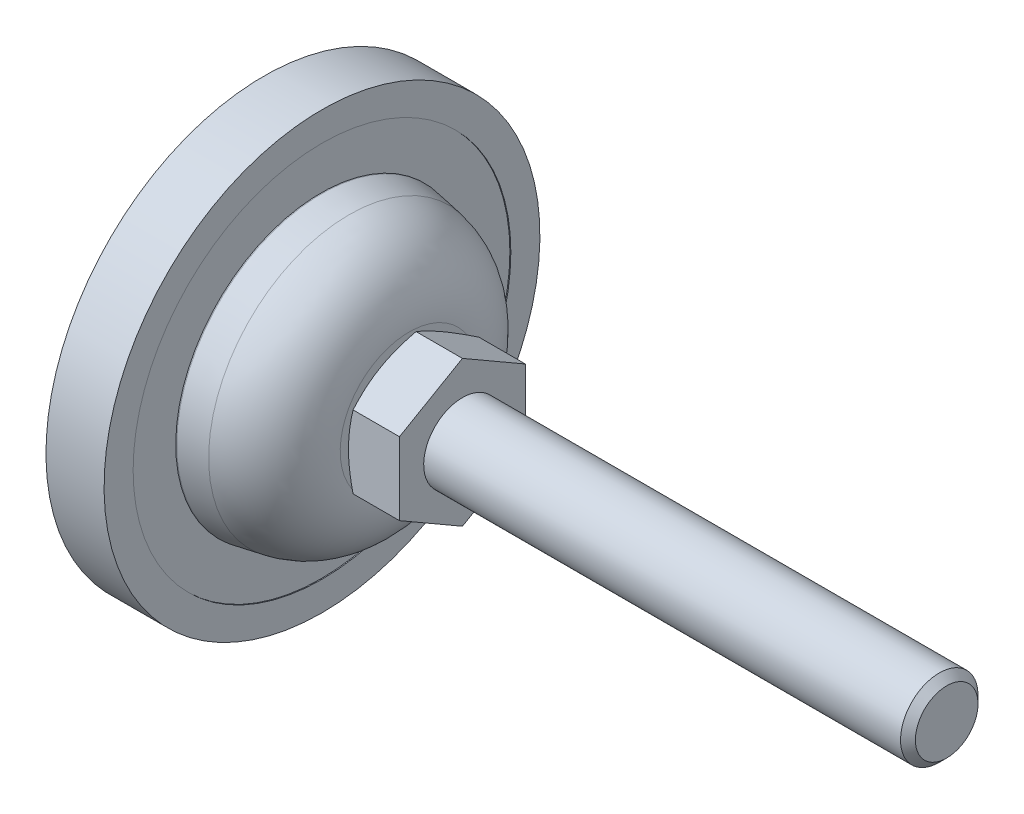
ISO-10303-21;
HEADER;
FILE_DESCRIPTION(('STEP AP214'),'2;1');
FILE_NAME('part.step','',(''),(''),'','','');
FILE_SCHEMA(('AUTOMOTIVE_DESIGN { 1 0 10303 214 1 1 1 1 }'));
ENDSEC;
DATA;
#1=APPLICATION_CONTEXT('core data for automotive mechanical design processes');
#2=APPLICATION_PROTOCOL_DEFINITION('international standard','automotive_design',2000,#1);
#3=PRODUCT_CONTEXT('',#1,'mechanical');
#4=PRODUCT('Part','Part','',(#3));
#5=PRODUCT_RELATED_PRODUCT_CATEGORY('part','',(#4));
#6=PRODUCT_DEFINITION_FORMATION('','',#4);
#7=PRODUCT_DEFINITION_CONTEXT('part definition',#1,'design');
#8=PRODUCT_DEFINITION('design','',#6,#7);
#9=PRODUCT_DEFINITION_SHAPE('','',#8);
#10=(LENGTH_UNIT() NAMED_UNIT(*) SI_UNIT(.MILLI.,.METRE.));
#11=(NAMED_UNIT(*) PLANE_ANGLE_UNIT() SI_UNIT($,.RADIAN.));
#12=(NAMED_UNIT(*) SI_UNIT($,.STERADIAN.) SOLID_ANGLE_UNIT());
#13=UNCERTAINTY_MEASURE_WITH_UNIT(LENGTH_MEASURE(1.E-05),#10,'distance_accuracy_value','');
#14=(GEOMETRIC_REPRESENTATION_CONTEXT(3) GLOBAL_UNCERTAINTY_ASSIGNED_CONTEXT((#13)) GLOBAL_UNIT_ASSIGNED_CONTEXT((#10,
#11,#12)) REPRESENTATION_CONTEXT('',''));
#15=CARTESIAN_POINT('',(0.,0.,0.));
#16=DIRECTION('',(0.,0.,1.));
#17=DIRECTION('',(1.,0.,0.));
#18=AXIS2_PLACEMENT_3D('',#15,#16,#17);
#19=CARTESIAN_POINT('',(0.,22.77,-22.77));
#20=DIRECTION('',(-1.,0.,0.));
#21=DIRECTION('',(0.,-1.,0.));
#22=AXIS2_PLACEMENT_3D('',#19,#20,#21);
#23=PLANE('',#22);
#24=CARTESIAN_POINT('',(0.,0.,0.));
#25=DIRECTION('',(-1.,0.,0.));
#26=DIRECTION('',(0.,-1.,0.));
#27=AXIS2_PLACEMENT_3D('',#24,#25,#26);
#28=CIRCLE('',#27,22.5);
#29=CARTESIAN_POINT('',(0.,-22.5,0.));
#30=VERTEX_POINT('',#29);
#31=EDGE_CURVE('E20',#30,#30,#28,.F.);
#32=ORIENTED_EDGE('',*,*,#31,.F.);
#33=EDGE_LOOP('',(#32));
#34=FACE_BOUND('',#33,.T.);
#35=ADVANCED_FACE('F17',(#34),#23,.T.);
#36=CARTESIAN_POINT('',(0.,0.,0.));
#37=DIRECTION('',(-1.,0.,0.));
#38=DIRECTION('',(0.,-1.,0.));
#39=AXIS2_PLACEMENT_3D('',#36,#37,#38);
#40=CYLINDRICAL_SURFACE('',#39,22.5);
#41=ORIENTED_EDGE('',*,*,#31,.T.);
#42=DIRECTION('',(-1.,0.,0.));
#43=VECTOR('',#42,1.);
#44=CARTESIAN_POINT('',(3.,-22.5,0.));
#45=LINE('',#44,#43);
#46=CARTESIAN_POINT('',(6.,-22.5,0.));
#47=VERTEX_POINT('',#46);
#48=EDGE_CURVE('E448',#47,#30,#45,.T.);
#49=ORIENTED_EDGE('',*,*,#48,.F.);
#50=CARTESIAN_POINT('',(6.,0.,0.));
#51=DIRECTION('',(-1.,0.,0.));
#52=DIRECTION('',(0.,-1.,0.));
#53=AXIS2_PLACEMENT_3D('',#50,#51,#52);
#54=CIRCLE('',#53,22.5);
#55=EDGE_CURVE('E34',#47,#47,#54,.F.);
#56=ORIENTED_EDGE('',*,*,#55,.F.);
#57=ORIENTED_EDGE('',*,*,#48,.T.);
#58=EDGE_LOOP('',(#41,#49,#56,#57));
#59=FACE_BOUND('',#58,.T.);
#60=ADVANCED_FACE('F413',(#59),#40,.T.);
#61=CARTESIAN_POINT('',(6.,-22.77,-22.77));
#62=DIRECTION('',(1.,0.,0.));
#63=DIRECTION('',(0.,1.,0.));
#64=AXIS2_PLACEMENT_3D('',#61,#62,#63);
#65=PLANE('',#64);
#66=CARTESIAN_POINT('',(6.,0.,0.));
#67=DIRECTION('',(-1.,0.,0.));
#68=DIRECTION('',(0.,-1.,0.));
#69=AXIS2_PLACEMENT_3D('',#66,#67,#68);
#70=CIRCLE('',#69,19.5);
#71=CARTESIAN_POINT('',(6.,-19.5,0.));
#72=VERTEX_POINT('',#71);
#73=EDGE_CURVE('E449',#72,#72,#70,.F.);
#74=ORIENTED_EDGE('',*,*,#73,.F.);
#75=EDGE_LOOP('',(#74));
#76=FACE_BOUND('',#75,.T.);
#77=ORIENTED_EDGE('',*,*,#55,.T.);
#78=EDGE_LOOP('',(#77));
#79=FACE_BOUND('',#78,.T.);
#80=ADVANCED_FACE('F404',(#76,#79),#65,.T.);
#81=CARTESIAN_POINT('',(6.,0.,0.));
#82=DIRECTION('',(-1.,0.,0.));
#83=DIRECTION('',(0.,-1.,0.));
#84=AXIS2_PLACEMENT_3D('',#81,#82,#83);
#85=CYLINDRICAL_SURFACE('',#84,19.5);
#86=CARTESIAN_POINT('',(5.9,0.,0.));
#87=DIRECTION('',(-1.,0.,0.));
#88=DIRECTION('',(0.,-1.,0.));
#89=AXIS2_PLACEMENT_3D('',#86,#87,#88);
#90=CIRCLE('',#89,19.5);
#91=CARTESIAN_POINT('',(5.9,-19.5,0.));
#92=VERTEX_POINT('',#91);
#93=EDGE_CURVE('E454',#92,#92,#90,.F.);
#94=ORIENTED_EDGE('',*,*,#93,.F.);
#95=DIRECTION('',(-1.,0.,0.));
#96=VECTOR('',#95,1.);
#97=CARTESIAN_POINT('',(5.95,-19.5,0.));
#98=LINE('',#97,#96);
#99=EDGE_CURVE('E451',#72,#92,#98,.T.);
#100=ORIENTED_EDGE('',*,*,#99,.F.);
#101=ORIENTED_EDGE('',*,*,#73,.T.);
#102=ORIENTED_EDGE('',*,*,#99,.T.);
#103=EDGE_LOOP('',(#94,#100,#101,#102));
#104=FACE_BOUND('',#103,.T.);
#105=ADVANCED_FACE('F395',(#104),#85,.F.);
#106=CARTESIAN_POINT('',(5.9,-19.734,-19.734));
#107=DIRECTION('',(1.,0.,0.));
#108=DIRECTION('',(0.,1.,0.));
#109=AXIS2_PLACEMENT_3D('',#106,#107,#108);
#110=PLANE('',#109);
#111=CARTESIAN_POINT('',(5.9,0.,0.));
#112=DIRECTION('',(-1.,0.,0.));
#113=DIRECTION('',(0.,-1.,0.));
#114=AXIS2_PLACEMENT_3D('',#111,#112,#113);
#115=CIRCLE('',#114,15.);
#116=CARTESIAN_POINT('',(5.9,-15.,0.));
#117=VERTEX_POINT('',#116);
#118=EDGE_CURVE('E458',#117,#117,#115,.F.);
#119=ORIENTED_EDGE('',*,*,#118,.F.);
#120=EDGE_LOOP('',(#119));
#121=FACE_BOUND('',#120,.T.);
#122=ORIENTED_EDGE('',*,*,#93,.T.);
#123=EDGE_LOOP('',(#122));
#124=FACE_BOUND('',#123,.T.);
#125=ADVANCED_FACE('F386',(#121,#124),#110,.T.);
#126=CARTESIAN_POINT('',(70.5,-3.271796,-3.27179600000001));
#127=DIRECTION('',(1.,0.,0.));
#128=DIRECTION('',(0.,1.,0.));
#129=AXIS2_PLACEMENT_3D('',#126,#127,#128);
#130=PLANE('',#129);
#131=CARTESIAN_POINT('',(70.5,0.,0.));
#132=DIRECTION('',(-1.,0.,0.));
#133=DIRECTION('',(0.,0.,1.));
#134=AXIS2_PLACEMENT_3D('',#131,#132,#133);
#135=CIRCLE('',#134,3.233);
#136=CARTESIAN_POINT('',(70.5,-3.23299999999999,0.));
#137=VERTEX_POINT('',#136);
#138=EDGE_CURVE('E463',#137,#137,#135,.T.);
#139=ORIENTED_EDGE('',*,*,#138,.F.);
#140=EDGE_LOOP('',(#139));
#141=FACE_BOUND('',#140,.T.);
#142=ADVANCED_FACE('F377',(#141),#130,.T.);
#143=CARTESIAN_POINT('',(5.9,0.,0.));
#144=DIRECTION('',(-1.,0.,0.));
#145=DIRECTION('',(0.,-1.,0.));
#146=AXIS2_PLACEMENT_3D('',#143,#144,#145);
#147=CYLINDRICAL_SURFACE('',#146,15.);
#148=ORIENTED_EDGE('',*,*,#118,.T.);
#149=DIRECTION('',(-1.,0.,0.));
#150=VECTOR('',#149,1.);
#151=CARTESIAN_POINT('',(5.95,-15.,0.));
#152=LINE('',#151,#150);
#153=CARTESIAN_POINT('',(6.,-15.,0.));
#154=VERTEX_POINT('',#153);
#155=EDGE_CURVE('E455',#154,#117,#152,.T.);
#156=ORIENTED_EDGE('',*,*,#155,.F.);
#157=CARTESIAN_POINT('',(6.,0.,0.));
#158=DIRECTION('',(1.,0.,0.));
#159=DIRECTION('',(0.,-1.,0.));
#160=AXIS2_PLACEMENT_3D('',#157,#158,#159);
#161=CIRCLE('',#160,15.);
#162=EDGE_CURVE('E466',#154,#154,#161,.T.);
#163=ORIENTED_EDGE('',*,*,#162,.F.);
#164=ORIENTED_EDGE('',*,*,#155,.T.);
#165=EDGE_LOOP('',(#148,#156,#163,#164));
#166=FACE_BOUND('',#165,.T.);
#167=ADVANCED_FACE('F368',(#166),#147,.T.);
#168=CARTESIAN_POINT('',(70.5,0.,0.));
#169=DIRECTION('',(-1.,0.,0.));
#170=DIRECTION('',(0.,0.,1.));
#171=AXIS2_PLACEMENT_3D('',#168,#169,#170);
#172=CONICAL_SURFACE('',#171,3.233,0.785398163397446);
#173=CARTESIAN_POINT('',(69.733,0.,0.));
#174=DIRECTION('',(-1.,0.,0.));
#175=DIRECTION('',(0.,-1.,0.));
#176=AXIS2_PLACEMENT_3D('',#173,#174,#175);
#177=CIRCLE('',#176,4.);
#178=CARTESIAN_POINT('',(69.733,-4.,0.));
#179=VERTEX_POINT('',#178);
#180=EDGE_CURVE('E205',#179,#179,#177,.T.);
#181=ORIENTED_EDGE('',*,*,#180,.F.);
#182=DIRECTION('',(-0.707106781186549,-0.707106781186546,0.));
#183=VECTOR('',#182,1.);
#184=CARTESIAN_POINT('',(70.1165,-3.6165,0.));
#185=LINE('',#184,#183);
#186=EDGE_CURVE('E459',#137,#179,#185,.T.);
#187=ORIENTED_EDGE('',*,*,#186,.F.);
#188=ORIENTED_EDGE('',*,*,#138,.T.);
#189=ORIENTED_EDGE('',*,*,#186,.T.);
#190=EDGE_LOOP('',(#181,#187,#188,#189));
#191=FACE_BOUND('',#190,.T.);
#192=ADVANCED_FACE('F360',(#191),#172,.T.);
#193=CARTESIAN_POINT('',(8.80236133250197,0.,0.));
#194=DIRECTION('',(-1.,0.,0.));
#195=DIRECTION('',(0.,-1.,0.));
#196=AXIS2_PLACEMENT_3D('',#193,#194,#195);
#197=CONICAL_SURFACE('',#196,14.5058680873858,0.174532925199431);
#198=ORIENTED_EDGE('',*,*,#162,.T.);
#199=DIRECTION('',(-0.984807753012208,-0.173648177666929,0.));
#200=VECTOR('',#199,1.);
#201=CARTESIAN_POINT('',(7.40118066625099,-14.7529340436929,0.));
#202=LINE('',#201,#200);
#203=CARTESIAN_POINT('',(8.80236133250196,-14.5058680873858,0.));
#204=VERTEX_POINT('',#203);
#205=EDGE_CURVE('E462',#204,#154,#202,.T.);
#206=ORIENTED_EDGE('',*,*,#205,.F.);
#207=CARTESIAN_POINT('',(8.80236133250196,0.,0.));
#208=DIRECTION('',(-1.,0.,0.));
#209=DIRECTION('',(0.,-1.,0.));
#210=AXIS2_PLACEMENT_3D('',#207,#208,#209);
#211=CIRCLE('',#210,14.5058680873858);
#212=EDGE_CURVE('E178',#204,#204,#211,.F.);
#213=ORIENTED_EDGE('',*,*,#212,.F.);
#214=ORIENTED_EDGE('',*,*,#205,.T.);
#215=EDGE_LOOP('',(#198,#206,#213,#214));
#216=FACE_BOUND('',#215,.T.);
#217=ADVANCED_FACE('F352',(#216),#197,.T.);
#218=CARTESIAN_POINT('',(20.5,0.,0.));
#219=DIRECTION('',(-1.,0.,0.));
#220=DIRECTION('',(0.,0.,1.));
#221=AXIS2_PLACEMENT_3D('',#218,#219,#220);
#222=CYLINDRICAL_SURFACE('',#221,4.);
#223=CARTESIAN_POINT('',(20.5,0.,0.));
#224=DIRECTION('',(-1.,0.,0.));
#225=DIRECTION('',(0.,0.,1.));
#226=AXIS2_PLACEMENT_3D('',#223,#224,#225);
#227=CIRCLE('',#226,4.);
#228=CARTESIAN_POINT('',(20.5,-4.,0.));
#229=VERTEX_POINT('',#228);
#230=EDGE_CURVE('E490',#229,#229,#227,.T.);
#231=ORIENTED_EDGE('',*,*,#230,.F.);
#232=DIRECTION('',(-1.,0.,0.));
#233=VECTOR('',#232,1.);
#234=CARTESIAN_POINT('',(45.1165,-4.,0.));
#235=LINE('',#234,#233);
#236=EDGE_CURVE('E468',#179,#229,#235,.T.);
#237=ORIENTED_EDGE('',*,*,#236,.F.);
#238=ORIENTED_EDGE('',*,*,#180,.T.);
#239=ORIENTED_EDGE('',*,*,#236,.T.);
#240=EDGE_LOOP('',(#231,#237,#238,#239));
#241=FACE_BOUND('',#240,.T.);
#242=ADVANCED_FACE('F186',(#241),#222,.T.);
#243=CARTESIAN_POINT('',(7.5,-7.11980993979422,0.));
#244=DIRECTION('',(0.,0.,1.));
#245=DIRECTION('',(-0.314347477128451,0.949307991972562,0.));
#246=AXIS2_PLACEMENT_3D('',#243,#244,#245);
#247=CIRCLE('',#246,7.5);
#248=TRIMMED_CURVE('',#247,(PARAMETER_VALUE(0.)),(PARAMETER_VALUE(5.64364688943372)),.T.,.PARAMETER.);
#249=CARTESIAN_POINT('',(7.5,0.,0.));
#250=DIRECTION('',(-1.,0.,0.));
#251=AXIS1_PLACEMENT('',#249,#250);
#252=SURFACE_OF_REVOLUTION('',#248,#251);
#253=ORIENTED_EDGE('',*,*,#212,.T.);
#254=CARTESIAN_POINT('',(7.5,-7.11980993979422,0.));
#255=DIRECTION('',(0.,0.,1.));
#256=DIRECTION('',(-0.314347477128451,0.949307991972562,0.));
#257=AXIS2_PLACEMENT_3D('',#254,#255,#256);
#258=CIRCLE('',#257,7.5);
#259=CARTESIAN_POINT('',(15.,-7.1198099397942,0.));
#260=VERTEX_POINT('',#259);
#261=EDGE_CURVE('E470',#260,#204,#258,.F.);
#262=ORIENTED_EDGE('',*,*,#261,.F.);
#263=CARTESIAN_POINT('',(15.,0.,0.));
#264=DIRECTION('',(-1.,0.,0.));
#265=DIRECTION('',(0.,-1.,0.));
#266=AXIS2_PLACEMENT_3D('',#263,#264,#265);
#267=CIRCLE('',#266,7.11980993979418);
#268=EDGE_CURVE('E164',#260,#260,#267,.F.);
#269=ORIENTED_EDGE('',*,*,#268,.F.);
#270=ORIENTED_EDGE('',*,*,#261,.T.);
#271=EDGE_LOOP('',(#253,#262,#269,#270));
#272=FACE_BOUND('',#271,.T.);
#273=ADVANCED_FACE('F181',(#272),#252,.F.);
#274=CARTESIAN_POINT('',(20.5,-7.59562014145872,-6.5));
#275=DIRECTION('',(1.,0.,0.));
#276=DIRECTION('',(0.,1.,0.));
#277=AXIS2_PLACEMENT_3D('',#274,#275,#276);
#278=PLANE('',#277);
#279=ORIENTED_EDGE('',*,*,#230,.T.);
#280=EDGE_LOOP('',(#279));
#281=FACE_BOUND('',#280,.T.);
#282=DIRECTION('',(0.,0.499999999999999,-0.866025403784439));
#283=VECTOR('',#282,1.);
#284=CARTESIAN_POINT('',(20.5,5.62916512459885,3.25));
#285=LINE('',#284,#283);
#286=CARTESIAN_POINT('',(20.5,3.75277674973257,6.5));
#287=VERTEX_POINT('',#286);
#288=CARTESIAN_POINT('',(20.5,7.50555350848935,-2.60506820108641E-08));
#289=VERTEX_POINT('',#288);
#290=EDGE_CURVE('E116',#287,#289,#285,.T.);
#291=ORIENTED_EDGE('',*,*,#290,.F.);
#292=DIRECTION('',(0.,1.,0.));
#293=VECTOR('',#292,1.);
#294=CARTESIAN_POINT('',(20.5,-3.75277674973257,6.5));
#295=LINE('',#294,#293);
#296=CARTESIAN_POINT('',(20.5,-3.75277674973257,6.5));
#297=VERTEX_POINT('',#296);
#298=EDGE_CURVE('E103',#297,#287,#295,.T.);
#299=ORIENTED_EDGE('',*,*,#298,.F.);
#300=DIRECTION('',(0.,0.5,0.866025403784439));
#301=VECTOR('',#300,1.);
#302=CARTESIAN_POINT('',(20.5,-5.62916512459886,3.25));
#303=LINE('',#302,#301);
#304=CARTESIAN_POINT('',(20.5,-7.50555349946514,0.));
#305=VERTEX_POINT('',#304);
#306=EDGE_CURVE('E139',#305,#297,#303,.T.);
#307=ORIENTED_EDGE('',*,*,#306,.F.);
#308=DIRECTION('',(0.,-0.499999999999999,0.866025403784439));
#309=VECTOR('',#308,1.);
#310=CARTESIAN_POINT('',(20.5,-5.62916512459885,-3.25));
#311=LINE('',#310,#309);
#312=CARTESIAN_POINT('',(20.5,-3.75277674973257,-6.5));
#313=VERTEX_POINT('',#312);
#314=EDGE_CURVE('E145',#313,#305,#311,.T.);
#315=ORIENTED_EDGE('',*,*,#314,.F.);
#316=DIRECTION('',(0.,1.,0.));
#317=VECTOR('',#316,1.);
#318=CARTESIAN_POINT('',(20.5,-3.75277674973257,-6.5));
#319=LINE('',#318,#317);
#320=CARTESIAN_POINT('',(20.5,3.75277674973257,-6.5));
#321=VERTEX_POINT('',#320);
#322=EDGE_CURVE('E151',#321,#313,#319,.F.);
#323=ORIENTED_EDGE('',*,*,#322,.F.);
#324=DIRECTION('',(0.,-0.5,-0.866025403784439));
#325=VECTOR('',#324,1.);
#326=CARTESIAN_POINT('',(20.5,5.62916512459886,-3.25));
#327=LINE('',#326,#325);
#328=EDGE_CURVE('E119',#289,#321,#327,.T.);
#329=ORIENTED_EDGE('',*,*,#328,.F.);
#330=EDGE_LOOP('',(#291,#299,#307,#315,#323,#329));
#331=FACE_BOUND('',#330,.T.);
#332=ADVANCED_FACE('F117',(#281,#331),#278,.T.);
#333=CARTESIAN_POINT('',(15.,-7.20524765907174,-7.20524765907175));
#334=DIRECTION('',(1.,0.,0.));
#335=DIRECTION('',(0.,1.,0.));
#336=AXIS2_PLACEMENT_3D('',#333,#334,#335);
#337=PLANE('',#336);
#338=CARTESIAN_POINT('',(15.,0.,0.));
#339=DIRECTION('',(1.,0.,0.));
#340=DIRECTION('',(0.,0.,-1.));
#341=AXIS2_PLACEMENT_3D('',#338,#339,#340);
#342=CIRCLE('',#341,6.);
#343=CARTESIAN_POINT('',(15.,6.,0.));
#344=VERTEX_POINT('',#343);
#345=EDGE_CURVE('E123',#344,#344,#342,.T.);
#346=ORIENTED_EDGE('',*,*,#345,.F.);
#347=EDGE_LOOP('',(#346));
#348=FACE_BOUND('',#347,.T.);
#349=ORIENTED_EDGE('',*,*,#268,.T.);
#350=EDGE_LOOP('',(#349));
#351=FACE_BOUND('',#350,.T.);
#352=ADVANCED_FACE('F207',(#348,#351),#337,.T.);
#353=CARTESIAN_POINT('',(15.2031477284837,3.75277674973257,-6.5));
#354=DIRECTION('',(0.,0.866025403784438,-0.5));
#355=DIRECTION('',(0.,0.5,0.866025403784438));
#356=AXIS2_PLACEMENT_3D('',#353,#354,#355);
#357=PLANE('',#356);
#358=DIRECTION('',(1.,0.,0.));
#359=VECTOR('',#358,1.);
#360=CARTESIAN_POINT('',(15.0906283938275,7.50555349946513,0.));
#361=LINE('',#360,#359);
#362=CARTESIAN_POINT('',(15.7084957644542,7.50555349946513,0.));
#363=VERTEX_POINT('',#362);
#364=EDGE_CURVE('E113',#289,#363,#361,.F.);
#365=ORIENTED_EDGE('',*,*,#364,.F.);
#366=ORIENTED_EDGE('',*,*,#328,.T.);
#367=DIRECTION('',(1.,0.,0.));
#368=VECTOR('',#367,1.);
#369=CARTESIAN_POINT('',(17.8121922938638,3.75277674973257,-6.5));
#370=LINE('',#369,#368);
#371=CARTESIAN_POINT('',(15.7084957644542,3.75277674973257,-6.5));
#372=VERTEX_POINT('',#371);
#373=EDGE_CURVE('E154',#372,#321,#370,.T.);
#374=ORIENTED_EDGE('',*,*,#373,.F.);
#375=CARTESIAN_POINT('',(15.7084957644542,7.50555349946514,0.));
#376=CARTESIAN_POINT('',(15.6555821787327,7.39310638635194,-0.194764113076501));
#377=CARTESIAN_POINT('',(15.606032097627,7.28024140267749,-0.390251999196083));
#378=CARTESIAN_POINT('',(15.51482030319,7.05365780937604,-0.782706294955713));
#379=CARTESIAN_POINT('',(15.4731628310392,6.93993877474377,-0.979673440726496));
#380=CARTESIAN_POINT('',(15.3989193933841,6.71163456676959,-1.37510792851956));
#381=CARTESIAN_POINT('',(15.3663426320186,6.59704863467252,-1.5735765847443));
#382=CARTESIAN_POINT('',(15.3114463374481,6.36727883309098,-1.97154955512855));
#383=CARTESIAN_POINT('',(15.2891249032605,6.25209507842855,-2.17105367041043));
#384=CARTESIAN_POINT('',(15.2559642775514,6.0237399992736,-2.56657626967323));
#385=CARTESIAN_POINT('',(15.2448939824982,5.91057716164099,-2.76258005398158));
#386=CARTESIAN_POINT('',(15.2338794973005,5.68410754968463,-3.15483692826039));
#387=CARTESIAN_POINT('',(15.2339359535484,5.570800767381,-3.35109003205242));
#388=CARTESIAN_POINT('',(15.2451686079258,5.34443525875236,-3.7431665940784));
#389=CARTESIAN_POINT('',(15.2563342312454,5.23137639900122,-3.93899028341317));
#390=CARTESIAN_POINT('',(15.2893077595515,5.00566094360135,-4.3299409202193));
#391=CARTESIAN_POINT('',(15.3111147032214,4.8930043125419,-4.52506792902381));
#392=CARTESIAN_POINT('',(15.3583007391268,4.69452730859362,-4.86884018399627));
#393=CARTESIAN_POINT('',(15.3816562083643,4.60858401681737,-5.01769833192245));
#394=CARTESIAN_POINT('',(15.4336656002299,4.43710231657878,-5.314713349304));
#395=CARTESIAN_POINT('',(15.4623193850766,4.35156389764713,-5.46287023689273));
#396=CARTESIAN_POINT('',(15.5246901810809,4.18020454978047,-5.75967333374965));
#397=CARTESIAN_POINT('',(15.5584480276259,4.09438736599281,-5.90831305623235));
#398=CARTESIAN_POINT('',(15.63032685993,3.92322783426259,-6.20477006138879));
#399=CARTESIAN_POINT('',(15.6684469734865,3.83788539496426,-6.35258750229536));
#400=CARTESIAN_POINT('',(15.7084957644542,3.75277674973256,-6.50000000000001));
#401=B_SPLINE_CURVE_WITH_KNOTS('',3,(#375,#376,#377,#378,#379,#380,#381,#382,#383,#384,#385,
#386,#387,#388,#389,#390,#391,#392,#393,#394,#395,#396,#397,#398,#399,#400),.UNSPECIFIED.,.F.,
.F.,(4,2,2,2,2,2,2,2,2,2,2,2,4),(0.,0.693144406484556,1.38666023186759,2.08087646447404,
2.77496396145901,3.454487456346,4.13405042716361,4.81296714067107,5.49182253349617,
6.01213742607668,6.53243878990447,7.0571477324227,7.58175194600987),.UNSPECIFIED.);
#402=EDGE_CURVE('E137',#363,#372,#401,.T.);
#403=ORIENTED_EDGE('',*,*,#402,.F.);
#404=EDGE_LOOP('',(#365,#366,#374,#403));
#405=FACE_BOUND('',#404,.T.);
#406=ADVANCED_FACE('F216',(#405),#357,.T.);
#407=CARTESIAN_POINT('',(20.5,-3.75277674973257,-6.5));
#408=DIRECTION('',(0.,0.,-1.));
#409=DIRECTION('',(-1.,0.,0.));
#410=AXIS2_PLACEMENT_3D('',#407,#408,#409);
#411=PLANE('',#410);
#412=ORIENTED_EDGE('',*,*,#373,.T.);
#413=ORIENTED_EDGE('',*,*,#322,.T.);
#414=DIRECTION('',(1.,0.,0.));
#415=VECTOR('',#414,1.);
#416=CARTESIAN_POINT('',(15.0906283938275,-3.75277674973257,-6.5));
#417=LINE('',#416,#415);
#418=CARTESIAN_POINT('',(15.7084957644542,-3.75277674973256,-6.50000000000001));
#419=VERTEX_POINT('',#418);
#420=EDGE_CURVE('E148',#419,#313,#417,.T.);
#421=ORIENTED_EDGE('',*,*,#420,.F.);
#422=CARTESIAN_POINT('',(15.7084957644542,3.75277674973256,-6.5));
#423=CARTESIAN_POINT('',(15.6555821787327,3.52788252350617,-6.5));
#424=CARTESIAN_POINT('',(15.606032097627,3.30215255615727,-6.5));
#425=CARTESIAN_POINT('',(15.51482030319,2.84898536955438,-6.5));
#426=CARTESIAN_POINT('',(15.4731628310392,2.62154730028983,-6.5));
#427=CARTESIAN_POINT('',(15.3989193933841,2.16493888434146,-6.5));
#428=CARTESIAN_POINT('',(15.3663426320186,1.93576702014734,-6.5));
#429=CARTESIAN_POINT('',(15.3114463374481,1.47622741698426,-6.5));
#430=CARTESIAN_POINT('',(15.2891249032605,1.24585990765939,-6.5));
#431=CARTESIAN_POINT('',(15.2559642775514,0.789149749349484,-6.5));
#432=CARTESIAN_POINT('',(15.2448939824982,0.562824074084264,-6.5));
#433=CARTESIAN_POINT('',(15.2338794973005,0.109884850171553,-6.5));
#434=CARTESIAN_POINT('',(15.2339359535484,-0.116728714435705,-6.5));
#435=CARTESIAN_POINT('',(15.2451686079258,-0.569459731692982,-6.5));
#436=CARTESIAN_POINT('',(15.2563342312454,-0.795577451195261,-6.5));
#437=CARTESIAN_POINT('',(15.2893077595515,-1.24700836199501,-6.5));
#438=CARTESIAN_POINT('',(15.3111147032214,-1.47232162411391,-6.5));
#439=CARTESIAN_POINT('',(15.3583007391268,-1.86927563201045,-6.5));
#440=CARTESIAN_POINT('',(15.3816562083643,-2.04116221556295,-6.5));
#441=CARTESIAN_POINT('',(15.4336656002299,-2.38412561604014,-6.5));
#442=CARTESIAN_POINT('',(15.4623193850766,-2.55520245390344,-6.5));
#443=CARTESIAN_POINT('',(15.5246901810809,-2.89792114963675,-6.5));
#444=CARTESIAN_POINT('',(15.5584480276259,-3.06955551721207,-6.5));
#445=CARTESIAN_POINT('',(15.63032685993,-3.4118745806725,-6.5));
#446=CARTESIAN_POINT('',(15.6684469734865,-3.58255945926916,-6.5));
#447=CARTESIAN_POINT('',(15.7084957644542,-3.75277674973254,-6.5));
#448=B_SPLINE_CURVE_WITH_KNOTS('',3,(#422,#423,#424,#425,#426,#427,#428,#429,#430,#431,#432,
#433,#434,#435,#436,#437,#438,#439,#440,#441,#442,#443,#444,#445,#446,#447),.UNSPECIFIED.,.F.,
.F.,(4,2,2,2,2,2,2,2,2,2,2,2,4),(0.,0.693144406484556,1.38666023186759,2.08087646447404,
2.774963961459,3.454487456346,4.13405042716361,4.81296714067106,5.49182253349617,
6.01213742607666,6.53243878990445,7.05714773242266,7.58175194600984),.UNSPECIFIED.);
#449=EDGE_CURVE('E233',#372,#419,#448,.T.);
#450=ORIENTED_EDGE('',*,*,#449,.F.);
#451=EDGE_LOOP('',(#412,#413,#421,#450));
#452=FACE_BOUND('',#451,.T.);
#453=ADVANCED_FACE('F221',(#452),#411,.T.);
#454=CARTESIAN_POINT('',(15.2031477284837,-7.50555349946513,0.));
#455=DIRECTION('',(0.,-0.866025403784439,-0.499999999999999));
#456=DIRECTION('',(0.,0.499999999999999,-0.866025403784439));
#457=AXIS2_PLACEMENT_3D('',#454,#455,#456);
#458=PLANE('',#457);
#459=ORIENTED_EDGE('',*,*,#420,.T.);
#460=ORIENTED_EDGE('',*,*,#314,.T.);
#461=DIRECTION('',(1.,0.,0.));
#462=VECTOR('',#461,1.);
#463=CARTESIAN_POINT('',(15.0906283938275,-7.50555349946514,0.));
#464=LINE('',#463,#462);
#465=CARTESIAN_POINT('',(15.7084957644542,-7.50555349946514,0.));
#466=VERTEX_POINT('',#465);
#467=EDGE_CURVE('E142',#466,#305,#464,.T.);
#468=ORIENTED_EDGE('',*,*,#467,.F.);
#469=CARTESIAN_POINT('',(15.7084957644542,-3.75277674973256,-6.50000000000002));
#470=CARTESIAN_POINT('',(15.6555821787327,-3.86522386284575,-6.30523588692353));
#471=CARTESIAN_POINT('',(15.606032097627,-3.9780888465202,-6.10974800080394));
#472=CARTESIAN_POINT('',(15.51482030319,-4.20467243982165,-5.71729370504431));
#473=CARTESIAN_POINT('',(15.4731628310392,-4.31839147445392,-5.52032655927353));
#474=CARTESIAN_POINT('',(15.3989193933841,-4.54669568242811,-5.12489207148047));
#475=CARTESIAN_POINT('',(15.3663426320186,-4.66128161452517,-4.92642341525572));
#476=CARTESIAN_POINT('',(15.3114463374481,-4.89105141610671,-4.52845044487147));
#477=CARTESIAN_POINT('',(15.2891249032605,-5.00623517076915,-4.32894632958959));
#478=CARTESIAN_POINT('',(15.2559642775514,-5.2345902499241,-3.93342373032679));
#479=CARTESIAN_POINT('',(15.2448939824982,-5.34775308755671,-3.73741994601844));
#480=CARTESIAN_POINT('',(15.2338794973005,-5.57422269951307,-3.34516307173963));
#481=CARTESIAN_POINT('',(15.2339359535484,-5.6875294818167,-3.14890996794759));
#482=CARTESIAN_POINT('',(15.2451686079258,-5.91389499044533,-2.75683340592162));
#483=CARTESIAN_POINT('',(15.2563342312454,-6.02695385019647,-2.56100971658684));
#484=CARTESIAN_POINT('',(15.2893077595515,-6.25266930559635,-2.17005907978071));
#485=CARTESIAN_POINT('',(15.3111147032214,-6.3653259366558,-1.9749320709762));
#486=CARTESIAN_POINT('',(15.3583007391268,-6.56380294060407,-1.63115981600374));
#487=CARTESIAN_POINT('',(15.3816562083643,-6.64974623238032,-1.48230166807756));
#488=CARTESIAN_POINT('',(15.4336656002299,-6.82122793261892,-1.18528665069602));
#489=CARTESIAN_POINT('',(15.4623193850766,-6.90676635155057,-1.03712976310729));
#490=CARTESIAN_POINT('',(15.5246901810809,-7.07812569941723,-0.740326666250363));
#491=CARTESIAN_POINT('',(15.5584480276259,-7.16394288320488,-0.591686943767662));
#492=CARTESIAN_POINT('',(15.63032685993,-7.3351024149351,-0.295229938611226));
#493=CARTESIAN_POINT('',(15.6684469734865,-7.42044485423343,-0.147412497704659));
#494=CARTESIAN_POINT('',(15.7084957644542,-7.50555349946513,0.));
#495=B_SPLINE_CURVE_WITH_KNOTS('',3,(#469,#470,#471,#472,#473,#474,#475,#476,#477,#478,#479,
#480,#481,#482,#483,#484,#485,#486,#487,#488,#489,#490,#491,#492,#493,#494),.UNSPECIFIED.,.F.,
.F.,(4,2,2,2,2,2,2,2,2,2,2,2,4),(0.,0.693144406484559,1.3866602318676,2.08087646447405,
2.77496396145902,3.45448745634601,4.13405042716363,4.81296714067109,5.49182253349619,
6.01213742607669,6.53243878990448,7.0571477324227,7.58175194600988),.UNSPECIFIED.);
#496=EDGE_CURVE('E265',#419,#466,#495,.T.);
#497=ORIENTED_EDGE('',*,*,#496,.F.);
#498=EDGE_LOOP('',(#459,#460,#468,#497));
#499=FACE_BOUND('',#498,.T.);
#500=ADVANCED_FACE('F270',(#499),#458,.T.);
#501=CARTESIAN_POINT('',(15.2031477284837,-3.75277674973257,6.5));
#502=DIRECTION('',(0.,-0.866025403784438,0.5));
#503=DIRECTION('',(0.,-0.5,-0.866025403784438));
#504=AXIS2_PLACEMENT_3D('',#501,#502,#503);
#505=PLANE('',#504);
#506=ORIENTED_EDGE('',*,*,#467,.T.);
#507=ORIENTED_EDGE('',*,*,#306,.T.);
#508=DIRECTION('',(1.,0.,0.));
#509=VECTOR('',#508,1.);
#510=CARTESIAN_POINT('',(17.8121922938638,-3.75277674973257,6.5));
#511=LINE('',#510,#509);
#512=CARTESIAN_POINT('',(15.7084957644542,-3.75277674973257,6.5));
#513=VERTEX_POINT('',#512);
#514=EDGE_CURVE('E110',#513,#297,#511,.T.);
#515=ORIENTED_EDGE('',*,*,#514,.F.);
#516=CARTESIAN_POINT('',(15.7084957644542,-7.50555349946515,0.));
#517=CARTESIAN_POINT('',(15.6555821787327,-7.39310638635195,0.194764113076485));
#518=CARTESIAN_POINT('',(15.606032097627,-7.2802414026775,0.390251999196067));
#519=CARTESIAN_POINT('',(15.51482030319,-7.05365780937605,0.782706294955697));
#520=CARTESIAN_POINT('',(15.4731628310392,-6.93993877474378,0.97967344072648));
#521=CARTESIAN_POINT('',(15.3989193933841,-6.71163456676959,1.37510792851954));
#522=CARTESIAN_POINT('',(15.3663426320186,-6.59704863467253,1.57357658474429));
#523=CARTESIAN_POINT('',(15.3114463374481,-6.36727883309099,1.97154955512853));
#524=CARTESIAN_POINT('',(15.2891249032605,-6.25209507842856,2.17105367041042));
#525=CARTESIAN_POINT('',(15.2559642775514,-6.0237399992736,2.56657626967321));
#526=CARTESIAN_POINT('',(15.2448939824982,-5.91057716164099,2.76258005398156));
#527=CARTESIAN_POINT('',(15.2338794973005,-5.68410754968464,3.15483692826038));
#528=CARTESIAN_POINT('',(15.2339359535484,-5.57080076738101,3.35109003205241));
#529=CARTESIAN_POINT('',(15.2451686079258,-5.34443525875237,3.74316659407839));
#530=CARTESIAN_POINT('',(15.2563342312454,-5.23137639900123,3.93899028341316));
#531=CARTESIAN_POINT('',(15.2893077595515,-5.00566094360135,4.3299409202193));
#532=CARTESIAN_POINT('',(15.3111147032214,-4.8930043125419,4.5250679290238));
#533=CARTESIAN_POINT('',(15.3583007391268,-4.69452730859363,4.86884018399626));
#534=CARTESIAN_POINT('',(15.3816562083643,-4.60858401681738,5.01769833192244));
#535=CARTESIAN_POINT('',(15.4336656002299,-4.43710231657878,5.31471334930399));
#536=CARTESIAN_POINT('',(15.4623193850766,-4.35156389764713,5.46287023689272));
#537=CARTESIAN_POINT('',(15.5246901810809,-4.18020454978047,5.75967333374964));
#538=CARTESIAN_POINT('',(15.5584480276259,-4.09438736599281,5.90831305623234));
#539=CARTESIAN_POINT('',(15.63032685993,-3.9232278342626,6.20477006138878));
#540=CARTESIAN_POINT('',(15.6684469734865,-3.83788539496427,6.35258750229535));
#541=CARTESIAN_POINT('',(15.7084957644542,-3.75277674973257,6.5));
#542=B_SPLINE_CURVE_WITH_KNOTS('',3,(#516,#517,#518,#519,#520,#521,#522,#523,#524,#525,#526,
#527,#528,#529,#530,#531,#532,#533,#534,#535,#536,#537,#538,#539,#540,#541),.UNSPECIFIED.,.F.,
.F.,(4,2,2,2,2,2,2,2,2,2,2,2,4),(0.,0.693144406484558,1.38666023186759,2.08087646447405,
2.77496396145901,3.45448745634601,4.13405042716362,4.81296714067108,5.49182253349618,
6.01213742607669,6.53243878990448,7.0571477324227,7.58175194600988),.UNSPECIFIED.);
#543=EDGE_CURVE('E260',#466,#513,#542,.T.);
#544=ORIENTED_EDGE('',*,*,#543,.F.);
#545=EDGE_LOOP('',(#506,#507,#515,#544));
#546=FACE_BOUND('',#545,.T.);
#547=ADVANCED_FACE('F273',(#546),#505,.T.);
#548=CARTESIAN_POINT('',(15.2036734907577,-3.75277674973257,6.5));
#549=DIRECTION('',(0.,0.,1.));
#550=DIRECTION('',(1.,0.,0.));
#551=AXIS2_PLACEMENT_3D('',#548,#549,#550);
#552=PLANE('',#551);
#553=ORIENTED_EDGE('',*,*,#514,.T.);
#554=ORIENTED_EDGE('',*,*,#298,.T.);
#555=DIRECTION('',(1.,0.,0.));
#556=VECTOR('',#555,1.);
#557=CARTESIAN_POINT('',(15.0906283938275,3.75277674973257,6.5));
#558=LINE('',#557,#556);
#559=CARTESIAN_POINT('',(15.7084957644542,3.75277674973257,6.5));
#560=VERTEX_POINT('',#559);
#561=EDGE_CURVE('E108',#560,#287,#558,.T.);
#562=ORIENTED_EDGE('',*,*,#561,.F.);
#563=CARTESIAN_POINT('',(15.7084957644542,-3.75277674973257,6.5));
#564=CARTESIAN_POINT('',(15.6555821787327,-3.52788252350619,6.5));
#565=CARTESIAN_POINT('',(15.606032097627,-3.30215255615729,6.5));
#566=CARTESIAN_POINT('',(15.51482030319,-2.84898536955439,6.5));
#567=CARTESIAN_POINT('',(15.4731628310392,-2.62154730028984,6.5));
#568=CARTESIAN_POINT('',(15.3989193933841,-2.16493888434147,6.5));
#569=CARTESIAN_POINT('',(15.3663426320186,-1.93576702014735,6.5));
#570=CARTESIAN_POINT('',(15.3114463374481,-1.47622741698427,6.5));
#571=CARTESIAN_POINT('',(15.2891249032605,-1.2458599076594,6.5));
#572=CARTESIAN_POINT('',(15.2559642775514,-0.789149749349493,6.5));
#573=CARTESIAN_POINT('',(15.2448939824982,-0.562824074084272,6.5));
#574=CARTESIAN_POINT('',(15.2338794973005,-0.10988485017156,6.5));
#575=CARTESIAN_POINT('',(15.2339359535484,0.116728714435698,6.5));
#576=CARTESIAN_POINT('',(15.2451686079258,0.569459731692977,6.5));
#577=CARTESIAN_POINT('',(15.2563342312454,0.795577451195256,6.5));
#578=CARTESIAN_POINT('',(15.2893077595515,1.24700836199501,6.5));
#579=CARTESIAN_POINT('',(15.3111147032214,1.47232162411391,6.5));
#580=CARTESIAN_POINT('',(15.3583007391268,1.86927563201045,6.5));
#581=CARTESIAN_POINT('',(15.3816562083643,2.04116221556295,6.5));
#582=CARTESIAN_POINT('',(15.4336656002299,2.38412561604015,6.5));
#583=CARTESIAN_POINT('',(15.4623193850766,2.55520245390345,6.5));
#584=CARTESIAN_POINT('',(15.5246901810809,2.89792114963677,6.5));
#585=CARTESIAN_POINT('',(15.5584480276259,3.06955551721209,6.5));
#586=CARTESIAN_POINT('',(15.63032685993,3.41187458067253,6.5));
#587=CARTESIAN_POINT('',(15.6684469734865,3.58255945926918,6.5));
#588=CARTESIAN_POINT('',(15.7084957644542,3.75277674973257,6.5));
#589=B_SPLINE_CURVE_WITH_KNOTS('',3,(#563,#564,#565,#566,#567,#568,#569,#570,#571,#572,#573,
#574,#575,#576,#577,#578,#579,#580,#581,#582,#583,#584,#585,#586,#587,#588),.UNSPECIFIED.,.F.,
.F.,(4,2,2,2,2,2,2,2,2,2,2,2,4),(0.,0.693144406484557,1.38666023186759,2.08087646447404,
2.77496396145901,3.454487456346,4.13405042716362,4.81296714067108,5.49182253349618,
6.01213742607669,6.53243878990448,7.0571477324227,7.58175194600988),.UNSPECIFIED.);
#590=EDGE_CURVE('E26',#513,#560,#589,.T.);
#591=ORIENTED_EDGE('',*,*,#590,.F.);
#592=EDGE_LOOP('',(#553,#554,#562,#591));
#593=FACE_BOUND('',#592,.T.);
#594=ADVANCED_FACE('F105',(#593),#552,.T.);
#595=CARTESIAN_POINT('',(15.2031477284837,7.50555349946513,0.));
#596=DIRECTION('',(0.,0.866025403784439,0.499999999999999));
#597=DIRECTION('',(0.,-0.499999999999999,0.866025403784439));
#598=AXIS2_PLACEMENT_3D('',#595,#596,#597);
#599=PLANE('',#598);
#600=ORIENTED_EDGE('',*,*,#561,.T.);
#601=ORIENTED_EDGE('',*,*,#290,.T.);
#602=ORIENTED_EDGE('',*,*,#364,.T.);
#603=CARTESIAN_POINT('',(15.7084957644542,3.75277674973257,6.5));
#604=CARTESIAN_POINT('',(15.6555821787327,3.86522386284576,6.3052358869235));
#605=CARTESIAN_POINT('',(15.606032097627,3.97808884652022,6.10974800080392));
#606=CARTESIAN_POINT('',(15.51482030319,4.20467243982166,5.71729370504429));
#607=CARTESIAN_POINT('',(15.4731628310392,4.31839147445394,5.52032655927351));
#608=CARTESIAN_POINT('',(15.3989193933841,4.54669568242812,5.12489207148045));
#609=CARTESIAN_POINT('',(15.3663426320186,4.66128161452518,4.9264234152557));
#610=CARTESIAN_POINT('',(15.3114463374481,4.89105141610672,4.52845044487146));
#611=CARTESIAN_POINT('',(15.2891249032605,5.00623517076915,4.32894632958957));
#612=CARTESIAN_POINT('',(15.2559642775514,5.23459024992411,3.93342373032678));
#613=CARTESIAN_POINT('',(15.2448939824982,5.34775308755672,3.73741994601843));
#614=CARTESIAN_POINT('',(15.2338794973005,5.57422269951307,3.34516307173961));
#615=CARTESIAN_POINT('',(15.2339359535484,5.6875294818167,3.14890996794758));
#616=CARTESIAN_POINT('',(15.2451686079258,5.91389499044534,2.75683340592161));
#617=CARTESIAN_POINT('',(15.2563342312454,6.02695385019648,2.56100971658683));
#618=CARTESIAN_POINT('',(15.2893077595515,6.25266930559636,2.1700590797807));
#619=CARTESIAN_POINT('',(15.3111147032214,6.3653259366558,1.97493207097619));
#620=CARTESIAN_POINT('',(15.3583007391268,6.56380294060408,1.63115981600373));
#621=CARTESIAN_POINT('',(15.3816562083643,6.64974623238033,1.48230166807755));
#622=CARTESIAN_POINT('',(15.4336656002299,6.82122793261892,1.18528665069601));
#623=CARTESIAN_POINT('',(15.4623193850766,6.90676635155057,1.03712976310728));
#624=CARTESIAN_POINT('',(15.5246901810809,7.07812569941723,0.74032666625035));
#625=CARTESIAN_POINT('',(15.5584480276259,7.16394288320489,0.591686943767648));
#626=CARTESIAN_POINT('',(15.63032685993,7.33510241493511,0.295229938611211));
#627=CARTESIAN_POINT('',(15.6684469734865,7.42044485423344,0.147412497704644));
#628=CARTESIAN_POINT('',(15.7084957644542,7.50555349946513,0.));
#629=B_SPLINE_CURVE_WITH_KNOTS('',3,(#603,#604,#605,#606,#607,#608,#609,#610,#611,#612,#613,
#614,#615,#616,#617,#618,#619,#620,#621,#622,#623,#624,#625,#626,#627,#628),.UNSPECIFIED.,.F.,
.F.,(4,2,2,2,2,2,2,2,2,2,2,2,4),(0.,0.693144406484555,1.38666023186759,2.08087646447404,
2.77496396145901,3.454487456346,4.13405042716361,4.81296714067107,5.49182253349617,
6.01213742607667,6.53243878990447,7.05714773242269,7.58175194600987),.UNSPECIFIED.);
#630=EDGE_CURVE('E11',#560,#363,#629,.T.);
#631=ORIENTED_EDGE('',*,*,#630,.F.);
#632=EDGE_LOOP('',(#600,#601,#602,#631));
#633=FACE_BOUND('',#632,.T.);
#634=ADVANCED_FACE('F125',(#633),#599,.T.);
#635=CARTESIAN_POINT('',(15.,0.,0.));
#636=DIRECTION('',(1.,0.,0.));
#637=DIRECTION('',(0.,0.,-1.));
#638=AXIS2_PLACEMENT_3D('',#635,#636,#637);
#639=CONICAL_SURFACE('',#638,6.,1.13095374397916);
#640=ORIENTED_EDGE('',*,*,#630,.T.);
#641=DIRECTION('',(0.425797036329883,0.904818702200992,0.));
#642=VECTOR('',#641,1.);
#643=CARTESIAN_POINT('',(15.3563733695205,6.75729341023096,0.));
#644=LINE('',#643,#642);
#645=EDGE_CURVE('E134',#344,#363,#644,.T.);
#646=ORIENTED_EDGE('',*,*,#645,.F.);
#647=ORIENTED_EDGE('',*,*,#345,.T.);
#648=ORIENTED_EDGE('',*,*,#645,.T.);
#649=ORIENTED_EDGE('',*,*,#402,.T.);
#650=ORIENTED_EDGE('',*,*,#449,.T.);
#651=ORIENTED_EDGE('',*,*,#496,.T.);
#652=ORIENTED_EDGE('',*,*,#543,.T.);
#653=ORIENTED_EDGE('',*,*,#590,.T.);
#654=EDGE_LOOP('',(#640,#646,#647,#648,#649,#650,#651,#652,#653));
#655=FACE_BOUND('',#654,.T.);
#656=ADVANCED_FACE('F239',(#655),#639,.T.);
#657=CLOSED_SHELL('',(#35,#60,#80,#105,#125,#142,#167,#192,#217,#242,#273,#332,#352,#406,#453,
#500,#547,#594,#634,#656));
#658=MANIFOLD_SOLID_BREP('B1',#657);
#659=ADVANCED_BREP_SHAPE_REPRESENTATION('',(#18,#658),#14);
#660=SHAPE_DEFINITION_REPRESENTATION(#9,#659);
ENDSEC;
END-ISO-10303-21;
